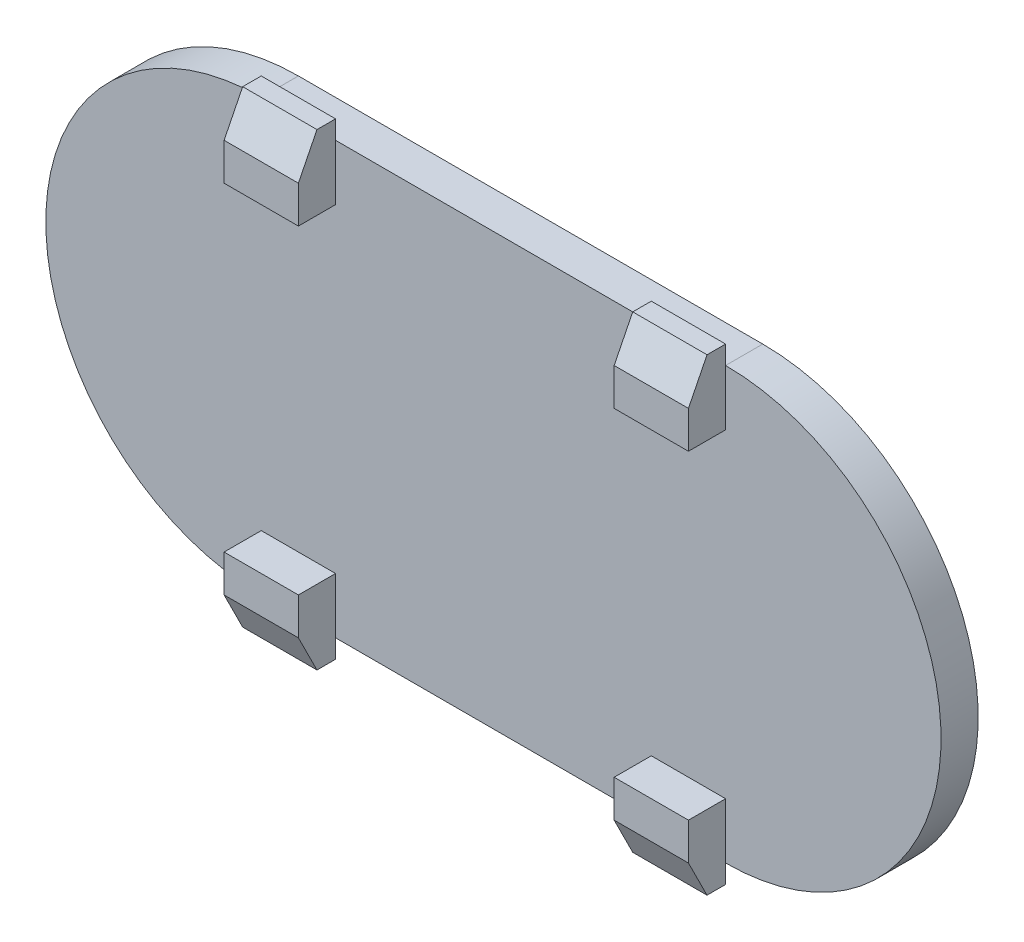
ISO-10303-21;
HEADER;
FILE_DESCRIPTION(('STEP AP214'),'2;1');
FILE_NAME('part.step','',(''),(''),'','','');
FILE_SCHEMA(('AUTOMOTIVE_DESIGN { 1 0 10303 214 1 1 1 1 }'));
ENDSEC;
DATA;
#1=APPLICATION_CONTEXT('core data for automotive mechanical design processes');
#2=APPLICATION_PROTOCOL_DEFINITION('international standard','automotive_design',2000,#1);
#3=PRODUCT_CONTEXT('',#1,'mechanical');
#4=PRODUCT('Part','Part','',(#3));
#5=PRODUCT_RELATED_PRODUCT_CATEGORY('part','',(#4));
#6=PRODUCT_DEFINITION_FORMATION('','',#4);
#7=PRODUCT_DEFINITION_CONTEXT('part definition',#1,'design');
#8=PRODUCT_DEFINITION('design','',#6,#7);
#9=PRODUCT_DEFINITION_SHAPE('','',#8);
#10=(LENGTH_UNIT() NAMED_UNIT(*) SI_UNIT(.MILLI.,.METRE.));
#11=(NAMED_UNIT(*) PLANE_ANGLE_UNIT() SI_UNIT($,.RADIAN.));
#12=(NAMED_UNIT(*) SI_UNIT($,.STERADIAN.) SOLID_ANGLE_UNIT());
#13=UNCERTAINTY_MEASURE_WITH_UNIT(LENGTH_MEASURE(1.E-05),#10,'distance_accuracy_value','');
#14=(GEOMETRIC_REPRESENTATION_CONTEXT(3) GLOBAL_UNCERTAINTY_ASSIGNED_CONTEXT((#13)) GLOBAL_UNIT_ASSIGNED_CONTEXT((#10,
#11,#12)) REPRESENTATION_CONTEXT('',''));
#15=CARTESIAN_POINT('',(0.,0.,0.));
#16=DIRECTION('',(0.,0.,1.));
#17=DIRECTION('',(1.,0.,0.));
#18=AXIS2_PLACEMENT_3D('',#15,#16,#17);
#19=CARTESIAN_POINT('',(5.25,-5.799657207509,1.75));
#20=DIRECTION('',(0.,-0.447213595499998,0.894427190999896));
#21=DIRECTION('',(0.,-0.894427190999896,-0.447213595499998));
#22=AXIS2_PLACEMENT_3D('',#19,#20,#21);
#23=PLANE('',#22);
#24=DIRECTION('',(1.,0.,0.));
#25=VECTOR('',#24,1.);
#26=CARTESIAN_POINT('',(0.,-5.299657207509,2.));
#27=LINE('',#26,#25);
#28=CARTESIAN_POINT('',(4.25,-5.29965720750901,2.00000000000001));
#29=VERTEX_POINT('',#28);
#30=CARTESIAN_POINT('',(6.25,-5.29965720750901,2.00000000000001));
#31=VERTEX_POINT('',#30);
#32=EDGE_CURVE('E280',#29,#31,#27,.T.);
#33=ORIENTED_EDGE('',*,*,#32,.F.);
#34=DIRECTION('',(0.,-0.894427190999896,-0.447213595499998));
#35=VECTOR('',#34,1.);
#36=CARTESIAN_POINT('',(4.25,-5.799657207509,1.75));
#37=LINE('',#36,#35);
#38=CARTESIAN_POINT('',(4.25,-6.299657207509,1.49999999999999));
#39=VERTEX_POINT('',#38);
#40=EDGE_CURVE('E210',#29,#39,#37,.T.);
#41=ORIENTED_EDGE('',*,*,#40,.T.);
#42=DIRECTION('',(1.,0.,0.));
#43=VECTOR('',#42,1.);
#44=CARTESIAN_POINT('',(4.25,-6.299657207509,1.49999999999999));
#45=LINE('',#44,#43);
#46=CARTESIAN_POINT('',(6.25,-6.299657207509,1.49999999999999));
#47=VERTEX_POINT('',#46);
#48=EDGE_CURVE('E213',#47,#39,#45,.F.);
#49=ORIENTED_EDGE('',*,*,#48,.F.);
#50=DIRECTION('',(0.,-0.894427190999896,-0.447213595499998));
#51=VECTOR('',#50,1.);
#52=CARTESIAN_POINT('',(6.25,-5.799657207509,1.75));
#53=LINE('',#52,#51);
#54=EDGE_CURVE('E200',#47,#31,#53,.F.);
#55=ORIENTED_EDGE('',*,*,#54,.T.);
#56=EDGE_LOOP('',(#33,#41,#49,#55));
#57=FACE_BOUND('',#56,.T.);
#58=ADVANCED_FACE('F17',(#57),#23,.T.);
#59=CARTESIAN_POINT('',(-5.25,-5.799657207509,1.75));
#60=DIRECTION('',(0.,-0.447213595499998,0.894427190999896));
#61=DIRECTION('',(0.,-0.894427190999896,-0.447213595499998));
#62=AXIS2_PLACEMENT_3D('',#59,#60,#61);
#63=PLANE('',#62);
#64=DIRECTION('',(1.,0.,0.));
#65=VECTOR('',#64,1.);
#66=CARTESIAN_POINT('',(0.,-5.299657207509,2.));
#67=LINE('',#66,#65);
#68=CARTESIAN_POINT('',(-6.25,-5.29965720750901,2.00000000000001));
#69=VERTEX_POINT('',#68);
#70=CARTESIAN_POINT('',(-4.25,-5.29965720750901,2.00000000000001));
#71=VERTEX_POINT('',#70);
#72=EDGE_CURVE('E252',#69,#71,#67,.T.);
#73=ORIENTED_EDGE('',*,*,#72,.F.);
#74=DIRECTION('',(0.,-0.894427190999896,-0.447213595499998));
#75=VECTOR('',#74,1.);
#76=CARTESIAN_POINT('',(-6.25,-5.799657207509,1.75));
#77=LINE('',#76,#75);
#78=CARTESIAN_POINT('',(-6.25,-6.299657207509,1.49999999999999));
#79=VERTEX_POINT('',#78);
#80=EDGE_CURVE('E349',#69,#79,#77,.T.);
#81=ORIENTED_EDGE('',*,*,#80,.T.);
#82=DIRECTION('',(1.,0.,0.));
#83=VECTOR('',#82,1.);
#84=CARTESIAN_POINT('',(-6.25,-6.299657207509,1.49999999999999));
#85=LINE('',#84,#83);
#86=CARTESIAN_POINT('',(-4.25,-6.299657207509,1.49999999999999));
#87=VERTEX_POINT('',#86);
#88=EDGE_CURVE('E216',#87,#79,#85,.F.);
#89=ORIENTED_EDGE('',*,*,#88,.F.);
#90=DIRECTION('',(0.,-0.894427190999896,-0.447213595499998));
#91=VECTOR('',#90,1.);
#92=CARTESIAN_POINT('',(-4.25,-5.799657207509,1.75));
#93=LINE('',#92,#91);
#94=EDGE_CURVE('E355',#87,#71,#93,.F.);
#95=ORIENTED_EDGE('',*,*,#94,.T.);
#96=EDGE_LOOP('',(#73,#81,#89,#95));
#97=FACE_BOUND('',#96,.T.);
#98=ADVANCED_FACE('F852',(#97),#63,.T.);
#99=CARTESIAN_POINT('',(-5.25,5.799657207509,1.75));
#100=DIRECTION('',(0.,0.447213595499998,0.894427190999896));
#101=DIRECTION('',(0.,-0.894427190999896,0.447213595499998));
#102=AXIS2_PLACEMENT_3D('',#99,#100,#101);
#103=PLANE('',#102);
#104=DIRECTION('',(1.,0.,0.));
#105=VECTOR('',#104,1.);
#106=CARTESIAN_POINT('',(0.,5.299657207509,2.));
#107=LINE('',#106,#105);
#108=CARTESIAN_POINT('',(-4.25,5.29965720750901,2.00000000000001));
#109=VERTEX_POINT('',#108);
#110=CARTESIAN_POINT('',(-6.25,5.29965720750901,2.00000000000001));
#111=VERTEX_POINT('',#110);
#112=EDGE_CURVE('E217',#109,#111,#107,.F.);
#113=ORIENTED_EDGE('',*,*,#112,.F.);
#114=DIRECTION('',(0.,-0.894427190999896,0.447213595499998));
#115=VECTOR('',#114,1.);
#116=CARTESIAN_POINT('',(-4.25,5.799657207509,1.75));
#117=LINE('',#116,#115);
#118=CARTESIAN_POINT('',(-4.25,6.299657207509,1.49999999999999));
#119=VERTEX_POINT('',#118);
#120=EDGE_CURVE('E341',#109,#119,#117,.F.);
#121=ORIENTED_EDGE('',*,*,#120,.T.);
#122=DIRECTION('',(1.,0.,0.));
#123=VECTOR('',#122,1.);
#124=CARTESIAN_POINT('',(-4.25,6.299657207509,1.49999999999999));
#125=LINE('',#124,#123);
#126=CARTESIAN_POINT('',(-6.25,6.299657207509,1.49999999999999));
#127=VERTEX_POINT('',#126);
#128=EDGE_CURVE('E243',#127,#119,#125,.T.);
#129=ORIENTED_EDGE('',*,*,#128,.F.);
#130=DIRECTION('',(0.,-0.894427190999896,0.447213595499998));
#131=VECTOR('',#130,1.);
#132=CARTESIAN_POINT('',(-6.25,5.799657207509,1.75));
#133=LINE('',#132,#131);
#134=EDGE_CURVE('E347',#127,#111,#133,.T.);
#135=ORIENTED_EDGE('',*,*,#134,.T.);
#136=EDGE_LOOP('',(#113,#121,#129,#135));
#137=FACE_BOUND('',#136,.T.);
#138=ADVANCED_FACE('F845',(#137),#103,.T.);
#139=CARTESIAN_POINT('',(5.25,5.799657207509,1.75));
#140=DIRECTION('',(0.,0.447213595499998,0.894427190999896));
#141=DIRECTION('',(0.,-0.894427190999896,0.447213595499998));
#142=AXIS2_PLACEMENT_3D('',#139,#140,#141);
#143=PLANE('',#142);
#144=DIRECTION('',(1.,0.,0.));
#145=VECTOR('',#144,1.);
#146=CARTESIAN_POINT('',(0.,5.299657207509,2.));
#147=LINE('',#146,#145);
#148=CARTESIAN_POINT('',(6.25,5.29965720750901,2.00000000000001));
#149=VERTEX_POINT('',#148);
#150=CARTESIAN_POINT('',(4.25,5.29965720750901,2.00000000000001));
#151=VERTEX_POINT('',#150);
#152=EDGE_CURVE('E304',#149,#151,#147,.F.);
#153=ORIENTED_EDGE('',*,*,#152,.F.);
#154=DIRECTION('',(0.,-0.894427190999896,0.447213595499998));
#155=VECTOR('',#154,1.);
#156=CARTESIAN_POINT('',(6.25,5.799657207509,1.75));
#157=LINE('',#156,#155);
#158=CARTESIAN_POINT('',(6.25,6.299657207509,1.49999999999999));
#159=VERTEX_POINT('',#158);
#160=EDGE_CURVE('E327',#149,#159,#157,.F.);
#161=ORIENTED_EDGE('',*,*,#160,.T.);
#162=DIRECTION('',(1.,0.,0.));
#163=VECTOR('',#162,1.);
#164=CARTESIAN_POINT('',(6.25,6.299657207509,1.49999999999999));
#165=LINE('',#164,#163);
#166=CARTESIAN_POINT('',(4.25,6.299657207509,1.49999999999999));
#167=VERTEX_POINT('',#166);
#168=EDGE_CURVE('E246',#167,#159,#165,.T.);
#169=ORIENTED_EDGE('',*,*,#168,.F.);
#170=DIRECTION('',(0.,-0.894427190999896,0.447213595499998));
#171=VECTOR('',#170,1.);
#172=CARTESIAN_POINT('',(4.25,5.799657207509,1.75));
#173=LINE('',#172,#171);
#174=EDGE_CURVE('E339',#167,#151,#173,.T.);
#175=ORIENTED_EDGE('',*,*,#174,.T.);
#176=EDGE_LOOP('',(#153,#161,#169,#175));
#177=FACE_BOUND('',#176,.T.);
#178=ADVANCED_FACE('F630',(#177),#143,.T.);
#179=CARTESIAN_POINT('',(0.,0.,2.));
#180=DIRECTION('',(0.,0.,1.));
#181=DIRECTION('',(1.,0.,0.));
#182=AXIS2_PLACEMENT_3D('',#179,#180,#181);
#183=PLANE('',#182);
#184=DIRECTION('',(0.,1.,0.));
#185=VECTOR('',#184,1.);
#186=CARTESIAN_POINT('',(4.25,6.299657207509,2.));
#187=LINE('',#186,#185);
#188=CARTESIAN_POINT('',(4.25,4.299657207509,2.));
#189=VERTEX_POINT('',#188);
#190=EDGE_CURVE('E321',#189,#151,#187,.T.);
#191=ORIENTED_EDGE('',*,*,#190,.F.);
#192=DIRECTION('',(1.,0.,0.));
#193=VECTOR('',#192,1.);
#194=CARTESIAN_POINT('',(4.25,4.299657207509,2.));
#195=LINE('',#194,#193);
#196=CARTESIAN_POINT('',(6.25,4.299657207509,2.));
#197=VERTEX_POINT('',#196);
#198=EDGE_CURVE('E312',#197,#189,#195,.F.);
#199=ORIENTED_EDGE('',*,*,#198,.F.);
#200=DIRECTION('',(0.,1.,0.));
#201=VECTOR('',#200,1.);
#202=CARTESIAN_POINT('',(6.25,0.,2.));
#203=LINE('',#202,#201);
#204=EDGE_CURVE('E324',#197,#149,#203,.T.);
#205=ORIENTED_EDGE('',*,*,#204,.T.);
#206=ORIENTED_EDGE('',*,*,#152,.T.);
#207=EDGE_LOOP('',(#191,#199,#205,#206));
#208=FACE_BOUND('',#207,.T.);
#209=ADVANCED_FACE('F627',(#208),#183,.T.);
#210=CARTESIAN_POINT('',(0.,0.,2.));
#211=DIRECTION('',(0.,0.,1.));
#212=DIRECTION('',(1.,0.,0.));
#213=AXIS2_PLACEMENT_3D('',#210,#211,#212);
#214=PLANE('',#213);
#215=DIRECTION('',(0.,1.,0.));
#216=VECTOR('',#215,1.);
#217=CARTESIAN_POINT('',(6.25,-6.299657207509,2.));
#218=LINE('',#217,#216);
#219=CARTESIAN_POINT('',(6.25,-4.299657207509,2.));
#220=VERTEX_POINT('',#219);
#221=EDGE_CURVE('E209',#220,#31,#218,.F.);
#222=ORIENTED_EDGE('',*,*,#221,.F.);
#223=DIRECTION('',(1.,0.,0.));
#224=VECTOR('',#223,1.);
#225=CARTESIAN_POINT('',(6.25,-4.299657207509,2.));
#226=LINE('',#225,#224);
#227=CARTESIAN_POINT('',(4.25,-4.299657207509,2.));
#228=VERTEX_POINT('',#227);
#229=EDGE_CURVE('E226',#228,#220,#226,.T.);
#230=ORIENTED_EDGE('',*,*,#229,.F.);
#231=DIRECTION('',(0.,1.,0.));
#232=VECTOR('',#231,1.);
#233=CARTESIAN_POINT('',(4.25,0.,2.));
#234=LINE('',#233,#232);
#235=EDGE_CURVE('E301',#228,#29,#234,.F.);
#236=ORIENTED_EDGE('',*,*,#235,.T.);
#237=ORIENTED_EDGE('',*,*,#32,.T.);
#238=EDGE_LOOP('',(#222,#230,#236,#237));
#239=FACE_BOUND('',#238,.T.);
#240=ADVANCED_FACE('F824',(#239),#214,.T.);
#241=CARTESIAN_POINT('',(0.,0.,2.));
#242=DIRECTION('',(0.,0.,1.));
#243=DIRECTION('',(1.,0.,0.));
#244=AXIS2_PLACEMENT_3D('',#241,#242,#243);
#245=PLANE('',#244);
#246=DIRECTION('',(0.,1.,0.));
#247=VECTOR('',#246,1.);
#248=CARTESIAN_POINT('',(-4.25,-6.299657207509,2.));
#249=LINE('',#248,#247);
#250=CARTESIAN_POINT('',(-4.25,-4.299657207509,2.));
#251=VERTEX_POINT('',#250);
#252=EDGE_CURVE('E283',#251,#71,#249,.F.);
#253=ORIENTED_EDGE('',*,*,#252,.F.);
#254=DIRECTION('',(1.,0.,0.));
#255=VECTOR('',#254,1.);
#256=CARTESIAN_POINT('',(-4.25,-4.299657207509,2.));
#257=LINE('',#256,#255);
#258=CARTESIAN_POINT('',(-6.25,-4.299657207509,2.));
#259=VERTEX_POINT('',#258);
#260=EDGE_CURVE('E266',#259,#251,#257,.T.);
#261=ORIENTED_EDGE('',*,*,#260,.F.);
#262=DIRECTION('',(0.,1.,0.));
#263=VECTOR('',#262,1.);
#264=CARTESIAN_POINT('',(-6.25,0.,2.));
#265=LINE('',#264,#263);
#266=EDGE_CURVE('E277',#259,#69,#265,.F.);
#267=ORIENTED_EDGE('',*,*,#266,.T.);
#268=ORIENTED_EDGE('',*,*,#72,.T.);
#269=EDGE_LOOP('',(#253,#261,#267,#268));
#270=FACE_BOUND('',#269,.T.);
#271=ADVANCED_FACE('F816',(#270),#245,.T.);
#272=CARTESIAN_POINT('',(0.,0.,2.));
#273=DIRECTION('',(0.,0.,1.));
#274=DIRECTION('',(1.,0.,0.));
#275=AXIS2_PLACEMENT_3D('',#272,#273,#274);
#276=PLANE('',#275);
#277=DIRECTION('',(0.,1.,0.));
#278=VECTOR('',#277,1.);
#279=CARTESIAN_POINT('',(-6.25,6.299657207509,2.));
#280=LINE('',#279,#278);
#281=CARTESIAN_POINT('',(-6.25,4.299657207509,2.));
#282=VERTEX_POINT('',#281);
#283=EDGE_CURVE('E255',#282,#111,#280,.T.);
#284=ORIENTED_EDGE('',*,*,#283,.F.);
#285=DIRECTION('',(1.,0.,0.));
#286=VECTOR('',#285,1.);
#287=CARTESIAN_POINT('',(-6.25,4.299657207509,2.));
#288=LINE('',#287,#286);
#289=CARTESIAN_POINT('',(-4.25,4.299657207509,2.));
#290=VERTEX_POINT('',#289);
#291=EDGE_CURVE('E236',#290,#282,#288,.F.);
#292=ORIENTED_EDGE('',*,*,#291,.F.);
#293=DIRECTION('',(0.,1.,0.));
#294=VECTOR('',#293,1.);
#295=CARTESIAN_POINT('',(-4.25,0.,2.));
#296=LINE('',#295,#294);
#297=EDGE_CURVE('E249',#290,#109,#296,.T.);
#298=ORIENTED_EDGE('',*,*,#297,.T.);
#299=ORIENTED_EDGE('',*,*,#112,.T.);
#300=EDGE_LOOP('',(#284,#292,#298,#299));
#301=FACE_BOUND('',#300,.T.);
#302=ADVANCED_FACE('F809',(#301),#276,.T.);
#303=CARTESIAN_POINT('',(4.25,-6.299657207509,1.));
#304=DIRECTION('',(0.,-1.,0.));
#305=DIRECTION('',(0.,0.,-1.));
#306=AXIS2_PLACEMENT_3D('',#303,#304,#305);
#307=PLANE('',#306);
#308=DIRECTION('',(0.,0.,1.));
#309=VECTOR('',#308,1.);
#310=CARTESIAN_POINT('',(4.25,-6.299657207509,1.));
#311=LINE('',#310,#309);
#312=CARTESIAN_POINT('',(4.25,-6.299657207509,1.));
#313=VERTEX_POINT('',#312);
#314=EDGE_CURVE('E296',#313,#39,#311,.T.);
#315=ORIENTED_EDGE('',*,*,#314,.F.);
#316=DIRECTION('',(1.,0.,0.));
#317=VECTOR('',#316,1.);
#318=CARTESIAN_POINT('',(0.,-6.299657207509,1.));
#319=LINE('',#318,#317);
#320=CARTESIAN_POINT('',(6.25,-6.299657207509,1.));
#321=VERTEX_POINT('',#320);
#322=EDGE_CURVE('E221',#313,#321,#319,.T.);
#323=ORIENTED_EDGE('',*,*,#322,.T.);
#324=DIRECTION('',(0.,0.,-1.));
#325=VECTOR('',#324,1.);
#326=CARTESIAN_POINT('',(6.25,-6.299657207509,1.));
#327=LINE('',#326,#325);
#328=EDGE_CURVE('E206',#47,#321,#327,.T.);
#329=ORIENTED_EDGE('',*,*,#328,.F.);
#330=ORIENTED_EDGE('',*,*,#48,.T.);
#331=EDGE_LOOP('',(#315,#323,#329,#330));
#332=FACE_BOUND('',#331,.T.);
#333=ADVANCED_FACE('F219',(#332),#307,.T.);
#334=CARTESIAN_POINT('',(-6.25,-6.299657207509,1.));
#335=DIRECTION('',(0.,-1.,0.));
#336=DIRECTION('',(0.,0.,-1.));
#337=AXIS2_PLACEMENT_3D('',#334,#335,#336);
#338=PLANE('',#337);
#339=DIRECTION('',(0.,0.,1.));
#340=VECTOR('',#339,1.);
#341=CARTESIAN_POINT('',(-6.25,-6.299657207509,1.));
#342=LINE('',#341,#340);
#343=CARTESIAN_POINT('',(-6.25,-6.299657207509,1.));
#344=VERTEX_POINT('',#343);
#345=EDGE_CURVE('E269',#344,#79,#342,.T.);
#346=ORIENTED_EDGE('',*,*,#345,.F.);
#347=DIRECTION('',(1.,0.,0.));
#348=VECTOR('',#347,1.);
#349=CARTESIAN_POINT('',(0.,-6.299657207509,1.));
#350=LINE('',#349,#348);
#351=CARTESIAN_POINT('',(-4.25,-6.299657207509,1.));
#352=VERTEX_POINT('',#351);
#353=EDGE_CURVE('E452',#344,#352,#350,.T.);
#354=ORIENTED_EDGE('',*,*,#353,.T.);
#355=DIRECTION('',(0.,0.,-1.));
#356=VECTOR('',#355,1.);
#357=CARTESIAN_POINT('',(-4.25,-6.299657207509,1.));
#358=LINE('',#357,#356);
#359=EDGE_CURVE('E286',#87,#352,#358,.T.);
#360=ORIENTED_EDGE('',*,*,#359,.F.);
#361=ORIENTED_EDGE('',*,*,#88,.T.);
#362=EDGE_LOOP('',(#346,#354,#360,#361));
#363=FACE_BOUND('',#362,.T.);
#364=ADVANCED_FACE('F642',(#363),#338,.T.);
#365=CARTESIAN_POINT('',(-4.25,6.299657207509,1.));
#366=DIRECTION('',(0.,1.,0.));
#367=DIRECTION('',(0.,0.,1.));
#368=AXIS2_PLACEMENT_3D('',#365,#366,#367);
#369=PLANE('',#368);
#370=DIRECTION('',(0.,0.,-1.));
#371=VECTOR('',#370,1.);
#372=CARTESIAN_POINT('',(-4.25,6.299657207509,1.));
#373=LINE('',#372,#371);
#374=CARTESIAN_POINT('',(-4.25,6.299657207509,1.));
#375=VERTEX_POINT('',#374);
#376=EDGE_CURVE('E239',#375,#119,#373,.F.);
#377=ORIENTED_EDGE('',*,*,#376,.F.);
#378=DIRECTION('',(1.,0.,0.));
#379=VECTOR('',#378,1.);
#380=CARTESIAN_POINT('',(0.,6.299657207509,1.));
#381=LINE('',#380,#379);
#382=CARTESIAN_POINT('',(-6.25,6.299657207509,1.));
#383=VERTEX_POINT('',#382);
#384=EDGE_CURVE('E428',#375,#383,#381,.F.);
#385=ORIENTED_EDGE('',*,*,#384,.T.);
#386=DIRECTION('',(0.,0.,1.));
#387=VECTOR('',#386,1.);
#388=CARTESIAN_POINT('',(-6.25,6.299657207509,1.));
#389=LINE('',#388,#387);
#390=EDGE_CURVE('E258',#127,#383,#389,.F.);
#391=ORIENTED_EDGE('',*,*,#390,.F.);
#392=ORIENTED_EDGE('',*,*,#128,.T.);
#393=EDGE_LOOP('',(#377,#385,#391,#392));
#394=FACE_BOUND('',#393,.T.);
#395=ADVANCED_FACE('F634',(#394),#369,.T.);
#396=CARTESIAN_POINT('',(6.25,6.299657207509,1.));
#397=DIRECTION('',(0.,1.,0.));
#398=DIRECTION('',(0.,0.,1.));
#399=AXIS2_PLACEMENT_3D('',#396,#397,#398);
#400=PLANE('',#399);
#401=DIRECTION('',(0.,0.,-1.));
#402=VECTOR('',#401,1.);
#403=CARTESIAN_POINT('',(6.25,6.299657207509,1.));
#404=LINE('',#403,#402);
#405=CARTESIAN_POINT('',(6.25,6.299657207509,1.));
#406=VERTEX_POINT('',#405);
#407=EDGE_CURVE('E315',#406,#159,#404,.F.);
#408=ORIENTED_EDGE('',*,*,#407,.F.);
#409=DIRECTION('',(1.,0.,0.));
#410=VECTOR('',#409,1.);
#411=CARTESIAN_POINT('',(0.,6.299657207509,1.));
#412=LINE('',#411,#410);
#413=CARTESIAN_POINT('',(4.25,6.299657207509,1.));
#414=VERTEX_POINT('',#413);
#415=EDGE_CURVE('E422',#406,#414,#412,.F.);
#416=ORIENTED_EDGE('',*,*,#415,.T.);
#417=DIRECTION('',(0.,0.,1.));
#418=VECTOR('',#417,1.);
#419=CARTESIAN_POINT('',(4.25,6.299657207509,1.));
#420=LINE('',#419,#418);
#421=EDGE_CURVE('E332',#167,#414,#420,.F.);
#422=ORIENTED_EDGE('',*,*,#421,.F.);
#423=ORIENTED_EDGE('',*,*,#168,.T.);
#424=EDGE_LOOP('',(#408,#416,#422,#423));
#425=FACE_BOUND('',#424,.T.);
#426=ADVANCED_FACE('F632',(#425),#400,.T.);
#427=CARTESIAN_POINT('',(4.25,6.299657207509,1.));
#428=DIRECTION('',(-1.,0.,0.));
#429=DIRECTION('',(0.,0.,1.));
#430=AXIS2_PLACEMENT_3D('',#427,#428,#429);
#431=PLANE('',#430);
#432=DIRECTION('',(0.,1.,0.));
#433=VECTOR('',#432,1.);
#434=CARTESIAN_POINT('',(4.25,0.,1.));
#435=LINE('',#434,#433);
#436=CARTESIAN_POINT('',(4.25,5.799657207509,1.));
#437=VERTEX_POINT('',#436);
#438=CARTESIAN_POINT('',(4.25,4.299657207509,1.));
#439=VERTEX_POINT('',#438);
#440=EDGE_CURVE('E435',#437,#439,#435,.F.);
#441=ORIENTED_EDGE('',*,*,#440,.T.);
#442=DIRECTION('',(0.,0.,-1.));
#443=VECTOR('',#442,1.);
#444=CARTESIAN_POINT('',(4.25,4.299657207509,1.));
#445=LINE('',#444,#443);
#446=EDGE_CURVE('E316',#189,#439,#445,.T.);
#447=ORIENTED_EDGE('',*,*,#446,.F.);
#448=ORIENTED_EDGE('',*,*,#190,.T.);
#449=ORIENTED_EDGE('',*,*,#174,.F.);
#450=ORIENTED_EDGE('',*,*,#421,.T.);
#451=DIRECTION('',(0.,1.,0.));
#452=VECTOR('',#451,1.);
#453=CARTESIAN_POINT('',(4.25,0.,1.));
#454=LINE('',#453,#452);
#455=EDGE_CURVE('E423',#414,#437,#454,.F.);
#456=ORIENTED_EDGE('',*,*,#455,.T.);
#457=EDGE_LOOP('',(#441,#447,#448,#449,#450,#456));
#458=FACE_BOUND('',#457,.T.);
#459=ADVANCED_FACE('F611',(#458),#431,.T.);
#460=CARTESIAN_POINT('',(4.25,4.299657207509,1.));
#461=DIRECTION('',(0.,-1.,0.));
#462=DIRECTION('',(0.,0.,-1.));
#463=AXIS2_PLACEMENT_3D('',#460,#461,#462);
#464=PLANE('',#463);
#465=DIRECTION('',(0.,0.,-1.));
#466=VECTOR('',#465,1.);
#467=CARTESIAN_POINT('',(6.25,4.299657207509,1.));
#468=LINE('',#467,#466);
#469=CARTESIAN_POINT('',(6.25,4.299657207509,1.));
#470=VERTEX_POINT('',#469);
#471=EDGE_CURVE('E228',#197,#470,#468,.T.);
#472=ORIENTED_EDGE('',*,*,#471,.F.);
#473=ORIENTED_EDGE('',*,*,#198,.T.);
#474=ORIENTED_EDGE('',*,*,#446,.T.);
#475=DIRECTION('',(-1.,0.,0.));
#476=VECTOR('',#475,1.);
#477=CARTESIAN_POINT('',(0.,4.299657207509,1.));
#478=LINE('',#477,#476);
#479=EDGE_CURVE('E414',#439,#470,#478,.F.);
#480=ORIENTED_EDGE('',*,*,#479,.T.);
#481=EDGE_LOOP('',(#472,#473,#474,#480));
#482=FACE_BOUND('',#481,.T.);
#483=ADVANCED_FACE('F623',(#482),#464,.T.);
#484=CARTESIAN_POINT('',(6.25,4.299657207509,1.));
#485=DIRECTION('',(1.,0.,0.));
#486=DIRECTION('',(0.,0.,-1.));
#487=AXIS2_PLACEMENT_3D('',#484,#485,#486);
#488=PLANE('',#487);
#489=DIRECTION('',(0.,1.,0.));
#490=VECTOR('',#489,1.);
#491=CARTESIAN_POINT('',(6.25,0.,1.));
#492=LINE('',#491,#490);
#493=CARTESIAN_POINT('',(6.25,5.799657207509,1.));
#494=VERTEX_POINT('',#493);
#495=EDGE_CURVE('E410',#470,#494,#492,.T.);
#496=ORIENTED_EDGE('',*,*,#495,.T.);
#497=DIRECTION('',(0.,1.,0.));
#498=VECTOR('',#497,1.);
#499=CARTESIAN_POINT('',(6.25,0.,1.));
#500=LINE('',#499,#498);
#501=EDGE_CURVE('E419',#494,#406,#500,.T.);
#502=ORIENTED_EDGE('',*,*,#501,.T.);
#503=ORIENTED_EDGE('',*,*,#407,.T.);
#504=ORIENTED_EDGE('',*,*,#160,.F.);
#505=ORIENTED_EDGE('',*,*,#204,.F.);
#506=ORIENTED_EDGE('',*,*,#471,.T.);
#507=EDGE_LOOP('',(#496,#502,#503,#504,#505,#506));
#508=FACE_BOUND('',#507,.T.);
#509=ADVANCED_FACE('F619',(#508),#488,.T.);
#510=CARTESIAN_POINT('',(6.25,-6.299657207509,1.));
#511=DIRECTION('',(1.,0.,0.));
#512=DIRECTION('',(0.,0.,-1.));
#513=AXIS2_PLACEMENT_3D('',#510,#511,#512);
#514=PLANE('',#513);
#515=DIRECTION('',(0.,1.,0.));
#516=VECTOR('',#515,1.);
#517=CARTESIAN_POINT('',(6.25,0.,1.));
#518=LINE('',#517,#516);
#519=CARTESIAN_POINT('',(6.25,-5.799657207509,1.));
#520=VERTEX_POINT('',#519);
#521=CARTESIAN_POINT('',(6.25,-4.299657207509,1.));
#522=VERTEX_POINT('',#521);
#523=EDGE_CURVE('E407',#520,#522,#518,.T.);
#524=ORIENTED_EDGE('',*,*,#523,.T.);
#525=DIRECTION('',(0.,0.,1.));
#526=VECTOR('',#525,1.);
#527=CARTESIAN_POINT('',(6.25,-4.299657207509,1.));
#528=LINE('',#527,#526);
#529=EDGE_CURVE('E223',#220,#522,#528,.F.);
#530=ORIENTED_EDGE('',*,*,#529,.F.);
#531=ORIENTED_EDGE('',*,*,#221,.T.);
#532=ORIENTED_EDGE('',*,*,#54,.F.);
#533=ORIENTED_EDGE('',*,*,#328,.T.);
#534=DIRECTION('',(0.,1.,0.));
#535=VECTOR('',#534,1.);
#536=CARTESIAN_POINT('',(6.25,0.,1.));
#537=LINE('',#536,#535);
#538=EDGE_CURVE('E479',#321,#520,#537,.T.);
#539=ORIENTED_EDGE('',*,*,#538,.T.);
#540=EDGE_LOOP('',(#524,#530,#531,#532,#533,#539));
#541=FACE_BOUND('',#540,.T.);
#542=ADVANCED_FACE('F204',(#541),#514,.T.);
#543=CARTESIAN_POINT('',(6.25,-4.299657207509,1.));
#544=DIRECTION('',(0.,1.,0.));
#545=DIRECTION('',(0.,0.,1.));
#546=AXIS2_PLACEMENT_3D('',#543,#544,#545);
#547=PLANE('',#546);
#548=DIRECTION('',(0.,0.,1.));
#549=VECTOR('',#548,1.);
#550=CARTESIAN_POINT('',(4.25,-4.299657207509,1.));
#551=LINE('',#550,#549);
#552=CARTESIAN_POINT('',(4.25,-4.299657207509,1.));
#553=VERTEX_POINT('',#552);
#554=EDGE_CURVE('E287',#228,#553,#551,.F.);
#555=ORIENTED_EDGE('',*,*,#554,.F.);
#556=ORIENTED_EDGE('',*,*,#229,.T.);
#557=ORIENTED_EDGE('',*,*,#529,.T.);
#558=DIRECTION('',(-1.,0.,0.));
#559=VECTOR('',#558,1.);
#560=CARTESIAN_POINT('',(0.,-4.299657207509,1.));
#561=LINE('',#560,#559);
#562=EDGE_CURVE('E409',#522,#553,#561,.T.);
#563=ORIENTED_EDGE('',*,*,#562,.T.);
#564=EDGE_LOOP('',(#555,#556,#557,#563));
#565=FACE_BOUND('',#564,.T.);
#566=ADVANCED_FACE('F579',(#565),#547,.T.);
#567=CARTESIAN_POINT('',(4.25,-4.299657207509,1.));
#568=DIRECTION('',(-1.,0.,0.));
#569=DIRECTION('',(0.,0.,1.));
#570=AXIS2_PLACEMENT_3D('',#567,#568,#569);
#571=PLANE('',#570);
#572=DIRECTION('',(0.,1.,0.));
#573=VECTOR('',#572,1.);
#574=CARTESIAN_POINT('',(4.25,0.,1.));
#575=LINE('',#574,#573);
#576=CARTESIAN_POINT('',(4.25,-5.799657207509,1.));
#577=VERTEX_POINT('',#576);
#578=EDGE_CURVE('E473',#553,#577,#575,.F.);
#579=ORIENTED_EDGE('',*,*,#578,.T.);
#580=DIRECTION('',(0.,1.,0.));
#581=VECTOR('',#580,1.);
#582=CARTESIAN_POINT('',(4.25,0.,1.));
#583=LINE('',#582,#581);
#584=EDGE_CURVE('E481',#577,#313,#583,.F.);
#585=ORIENTED_EDGE('',*,*,#584,.T.);
#586=ORIENTED_EDGE('',*,*,#314,.T.);
#587=ORIENTED_EDGE('',*,*,#40,.F.);
#588=ORIENTED_EDGE('',*,*,#235,.F.);
#589=ORIENTED_EDGE('',*,*,#554,.T.);
#590=EDGE_LOOP('',(#579,#585,#586,#587,#588,#589));
#591=FACE_BOUND('',#590,.T.);
#592=ADVANCED_FACE('F567',(#591),#571,.T.);
#593=CARTESIAN_POINT('',(-4.25,-6.299657207509,1.));
#594=DIRECTION('',(1.,0.,0.));
#595=DIRECTION('',(0.,0.,-1.));
#596=AXIS2_PLACEMENT_3D('',#593,#594,#595);
#597=PLANE('',#596);
#598=DIRECTION('',(0.,1.,0.));
#599=VECTOR('',#598,1.);
#600=CARTESIAN_POINT('',(-4.25,0.,1.));
#601=LINE('',#600,#599);
#602=CARTESIAN_POINT('',(-4.25,-5.799657207509,1.));
#603=VERTEX_POINT('',#602);
#604=CARTESIAN_POINT('',(-4.25,-4.299657207509,1.));
#605=VERTEX_POINT('',#604);
#606=EDGE_CURVE('E471',#603,#605,#601,.T.);
#607=ORIENTED_EDGE('',*,*,#606,.T.);
#608=DIRECTION('',(0.,0.,1.));
#609=VECTOR('',#608,1.);
#610=CARTESIAN_POINT('',(-4.25,-4.299657207509,1.));
#611=LINE('',#610,#609);
#612=EDGE_CURVE('E270',#251,#605,#611,.F.);
#613=ORIENTED_EDGE('',*,*,#612,.F.);
#614=ORIENTED_EDGE('',*,*,#252,.T.);
#615=ORIENTED_EDGE('',*,*,#94,.F.);
#616=ORIENTED_EDGE('',*,*,#359,.T.);
#617=DIRECTION('',(0.,1.,0.));
#618=VECTOR('',#617,1.);
#619=CARTESIAN_POINT('',(-4.25,0.,1.));
#620=LINE('',#619,#618);
#621=EDGE_CURVE('E79',#352,#603,#620,.T.);
#622=ORIENTED_EDGE('',*,*,#621,.T.);
#623=EDGE_LOOP('',(#607,#613,#614,#615,#616,#622));
#624=FACE_BOUND('',#623,.T.);
#625=ADVANCED_FACE('F687',(#624),#597,.T.);
#626=CARTESIAN_POINT('',(-4.25,-4.299657207509,1.));
#627=DIRECTION('',(0.,1.,0.));
#628=DIRECTION('',(0.,0.,1.));
#629=AXIS2_PLACEMENT_3D('',#626,#627,#628);
#630=PLANE('',#629);
#631=DIRECTION('',(0.,0.,1.));
#632=VECTOR('',#631,1.);
#633=CARTESIAN_POINT('',(-6.25,-4.299657207509,1.));
#634=LINE('',#633,#632);
#635=CARTESIAN_POINT('',(-6.25,-4.299657207509,1.));
#636=VERTEX_POINT('',#635);
#637=EDGE_CURVE('E259',#259,#636,#634,.F.);
#638=ORIENTED_EDGE('',*,*,#637,.F.);
#639=ORIENTED_EDGE('',*,*,#260,.T.);
#640=ORIENTED_EDGE('',*,*,#612,.T.);
#641=DIRECTION('',(-1.,0.,0.));
#642=VECTOR('',#641,1.);
#643=CARTESIAN_POINT('',(0.,-4.299657207509,1.));
#644=LINE('',#643,#642);
#645=EDGE_CURVE('E404',#605,#636,#644,.T.);
#646=ORIENTED_EDGE('',*,*,#645,.T.);
#647=EDGE_LOOP('',(#638,#639,#640,#646));
#648=FACE_BOUND('',#647,.T.);
#649=ADVANCED_FACE('F683',(#648),#630,.T.);
#650=CARTESIAN_POINT('',(-6.25,-4.299657207509,1.));
#651=DIRECTION('',(-1.,0.,0.));
#652=DIRECTION('',(0.,0.,1.));
#653=AXIS2_PLACEMENT_3D('',#650,#651,#652);
#654=PLANE('',#653);
#655=DIRECTION('',(0.,1.,0.));
#656=VECTOR('',#655,1.);
#657=CARTESIAN_POINT('',(-6.25,0.,1.));
#658=LINE('',#657,#656);
#659=CARTESIAN_POINT('',(-6.25,-5.799657207509,1.));
#660=VERTEX_POINT('',#659);
#661=EDGE_CURVE('E400',#636,#660,#658,.F.);
#662=ORIENTED_EDGE('',*,*,#661,.T.);
#663=DIRECTION('',(0.,1.,0.));
#664=VECTOR('',#663,1.);
#665=CARTESIAN_POINT('',(-6.25,0.,1.));
#666=LINE('',#665,#664);
#667=EDGE_CURVE('E459',#660,#344,#666,.F.);
#668=ORIENTED_EDGE('',*,*,#667,.T.);
#669=ORIENTED_EDGE('',*,*,#345,.T.);
#670=ORIENTED_EDGE('',*,*,#80,.F.);
#671=ORIENTED_EDGE('',*,*,#266,.F.);
#672=ORIENTED_EDGE('',*,*,#637,.T.);
#673=EDGE_LOOP('',(#662,#668,#669,#670,#671,#672));
#674=FACE_BOUND('',#673,.T.);
#675=ADVANCED_FACE('F680',(#674),#654,.T.);
#676=CARTESIAN_POINT('',(-6.25,6.299657207509,1.));
#677=DIRECTION('',(-1.,0.,0.));
#678=DIRECTION('',(0.,0.,1.));
#679=AXIS2_PLACEMENT_3D('',#676,#677,#678);
#680=PLANE('',#679);
#681=DIRECTION('',(0.,1.,0.));
#682=VECTOR('',#681,1.);
#683=CARTESIAN_POINT('',(-6.25,0.,1.));
#684=LINE('',#683,#682);
#685=CARTESIAN_POINT('',(-6.25,5.799657207509,1.));
#686=VERTEX_POINT('',#685);
#687=CARTESIAN_POINT('',(-6.25,4.299657207509,1.));
#688=VERTEX_POINT('',#687);
#689=EDGE_CURVE('E397',#686,#688,#684,.F.);
#690=ORIENTED_EDGE('',*,*,#689,.T.);
#691=DIRECTION('',(0.,0.,-1.));
#692=VECTOR('',#691,1.);
#693=CARTESIAN_POINT('',(-6.25,4.299657207509,1.));
#694=LINE('',#693,#692);
#695=EDGE_CURVE('E240',#282,#688,#694,.T.);
#696=ORIENTED_EDGE('',*,*,#695,.F.);
#697=ORIENTED_EDGE('',*,*,#283,.T.);
#698=ORIENTED_EDGE('',*,*,#134,.F.);
#699=ORIENTED_EDGE('',*,*,#390,.T.);
#700=DIRECTION('',(0.,1.,0.));
#701=VECTOR('',#700,1.);
#702=CARTESIAN_POINT('',(-6.25,0.,1.));
#703=LINE('',#702,#701);
#704=EDGE_CURVE('E62',#383,#686,#703,.F.);
#705=ORIENTED_EDGE('',*,*,#704,.T.);
#706=EDGE_LOOP('',(#690,#696,#697,#698,#699,#705));
#707=FACE_BOUND('',#706,.T.);
#708=ADVANCED_FACE('F676',(#707),#680,.T.);
#709=CARTESIAN_POINT('',(-6.25,4.299657207509,1.));
#710=DIRECTION('',(0.,-1.,0.));
#711=DIRECTION('',(0.,0.,-1.));
#712=AXIS2_PLACEMENT_3D('',#709,#710,#711);
#713=PLANE('',#712);
#714=DIRECTION('',(0.,0.,-1.));
#715=VECTOR('',#714,1.);
#716=CARTESIAN_POINT('',(-4.25,4.299657207509,1.));
#717=LINE('',#716,#715);
#718=CARTESIAN_POINT('',(-4.25,4.299657207509,1.));
#719=VERTEX_POINT('',#718);
#720=EDGE_CURVE('E482',#290,#719,#717,.T.);
#721=ORIENTED_EDGE('',*,*,#720,.F.);
#722=ORIENTED_EDGE('',*,*,#291,.T.);
#723=ORIENTED_EDGE('',*,*,#695,.T.);
#724=DIRECTION('',(-1.,0.,0.));
#725=VECTOR('',#724,1.);
#726=CARTESIAN_POINT('',(0.,4.299657207509,1.));
#727=LINE('',#726,#725);
#728=EDGE_CURVE('E399',#688,#719,#727,.F.);
#729=ORIENTED_EDGE('',*,*,#728,.T.);
#730=EDGE_LOOP('',(#721,#722,#723,#729));
#731=FACE_BOUND('',#730,.T.);
#732=ADVANCED_FACE('F673',(#731),#713,.T.);
#733=CARTESIAN_POINT('',(-4.25,4.299657207509,1.));
#734=DIRECTION('',(1.,0.,0.));
#735=DIRECTION('',(0.,0.,-1.));
#736=AXIS2_PLACEMENT_3D('',#733,#734,#735);
#737=PLANE('',#736);
#738=DIRECTION('',(0.,1.,0.));
#739=VECTOR('',#738,1.);
#740=CARTESIAN_POINT('',(-4.25,0.,1.));
#741=LINE('',#740,#739);
#742=CARTESIAN_POINT('',(-4.25,5.799657207509,1.));
#743=VERTEX_POINT('',#742);
#744=EDGE_CURVE('E394',#719,#743,#741,.T.);
#745=ORIENTED_EDGE('',*,*,#744,.T.);
#746=DIRECTION('',(0.,1.,0.));
#747=VECTOR('',#746,1.);
#748=CARTESIAN_POINT('',(-4.25,0.,1.));
#749=LINE('',#748,#747);
#750=EDGE_CURVE('E446',#743,#375,#749,.T.);
#751=ORIENTED_EDGE('',*,*,#750,.T.);
#752=ORIENTED_EDGE('',*,*,#376,.T.);
#753=ORIENTED_EDGE('',*,*,#120,.F.);
#754=ORIENTED_EDGE('',*,*,#297,.F.);
#755=ORIENTED_EDGE('',*,*,#720,.T.);
#756=EDGE_LOOP('',(#745,#751,#752,#753,#754,#755));
#757=FACE_BOUND('',#756,.T.);
#758=ADVANCED_FACE('F670',(#757),#737,.T.);
#759=CARTESIAN_POINT('',(0.,0.,1.));
#760=DIRECTION('',(0.,0.,1.));
#761=DIRECTION('',(1.,0.,0.));
#762=AXIS2_PLACEMENT_3D('',#759,#760,#761);
#763=PLANE('',#762);
#764=ORIENTED_EDGE('',*,*,#584,.F.);
#765=DIRECTION('',(1.,0.,0.));
#766=VECTOR('',#765,1.);
#767=CARTESIAN_POINT('',(6.25,-5.799657207509,1.));
#768=LINE('',#767,#766);
#769=EDGE_CURVE('E390',#520,#577,#768,.F.);
#770=ORIENTED_EDGE('',*,*,#769,.F.);
#771=ORIENTED_EDGE('',*,*,#538,.F.);
#772=ORIENTED_EDGE('',*,*,#322,.F.);
#773=EDGE_LOOP('',(#764,#770,#771,#772));
#774=FACE_BOUND('',#773,.T.);
#775=ADVANCED_FACE('F573',(#774),#763,.F.);
#776=CARTESIAN_POINT('',(0.,0.,1.));
#777=DIRECTION('',(0.,0.,1.));
#778=DIRECTION('',(1.,0.,0.));
#779=AXIS2_PLACEMENT_3D('',#776,#777,#778);
#780=PLANE('',#779);
#781=ORIENTED_EDGE('',*,*,#667,.F.);
#782=DIRECTION('',(1.,0.,0.));
#783=VECTOR('',#782,1.);
#784=CARTESIAN_POINT('',(6.25,-5.799657207509,1.));
#785=LINE('',#784,#783);
#786=EDGE_CURVE('E389',#603,#660,#785,.F.);
#787=ORIENTED_EDGE('',*,*,#786,.F.);
#788=ORIENTED_EDGE('',*,*,#621,.F.);
#789=ORIENTED_EDGE('',*,*,#353,.F.);
#790=EDGE_LOOP('',(#781,#787,#788,#789));
#791=FACE_BOUND('',#790,.T.);
#792=ADVANCED_FACE('F664',(#791),#780,.F.);
#793=CARTESIAN_POINT('',(0.,0.,1.));
#794=DIRECTION('',(0.,0.,1.));
#795=DIRECTION('',(1.,0.,0.));
#796=AXIS2_PLACEMENT_3D('',#793,#794,#795);
#797=PLANE('',#796);
#798=ORIENTED_EDGE('',*,*,#750,.F.);
#799=DIRECTION('',(1.,0.,0.));
#800=VECTOR('',#799,1.);
#801=CARTESIAN_POINT('',(-6.25,5.799657207509,1.));
#802=LINE('',#801,#800);
#803=EDGE_CURVE('E385',#686,#743,#802,.T.);
#804=ORIENTED_EDGE('',*,*,#803,.F.);
#805=ORIENTED_EDGE('',*,*,#704,.F.);
#806=ORIENTED_EDGE('',*,*,#384,.F.);
#807=EDGE_LOOP('',(#798,#804,#805,#806));
#808=FACE_BOUND('',#807,.T.);
#809=ADVANCED_FACE('F601',(#808),#797,.F.);
#810=CARTESIAN_POINT('',(0.,0.,1.));
#811=DIRECTION('',(0.,0.,1.));
#812=DIRECTION('',(1.,0.,0.));
#813=AXIS2_PLACEMENT_3D('',#810,#811,#812);
#814=PLANE('',#813);
#815=ORIENTED_EDGE('',*,*,#501,.F.);
#816=DIRECTION('',(1.,0.,0.));
#817=VECTOR('',#816,1.);
#818=CARTESIAN_POINT('',(-6.25,5.799657207509,1.));
#819=LINE('',#818,#817);
#820=EDGE_CURVE('E376',#437,#494,#819,.T.);
#821=ORIENTED_EDGE('',*,*,#820,.F.);
#822=ORIENTED_EDGE('',*,*,#455,.F.);
#823=ORIENTED_EDGE('',*,*,#415,.F.);
#824=EDGE_LOOP('',(#815,#821,#822,#823));
#825=FACE_BOUND('',#824,.T.);
#826=ADVANCED_FACE('F617',(#825),#814,.F.);
#827=CARTESIAN_POINT('',(0.,0.,1.));
#828=DIRECTION('',(0.,0.,-1.));
#829=DIRECTION('',(-1.,0.,0.));
#830=AXIS2_PLACEMENT_3D('',#827,#828,#829);
#831=PLANE('',#830);
#832=ORIENTED_EDGE('',*,*,#728,.F.);
#833=ORIENTED_EDGE('',*,*,#689,.F.);
#834=CARTESIAN_POINT('',(-6.25,0.,1.));
#835=DIRECTION('',(0.,0.,-1.));
#836=DIRECTION('',(-1.,0.,0.));
#837=AXIS2_PLACEMENT_3D('',#834,#835,#836);
#838=CIRCLE('',#837,5.799657207509);
#839=EDGE_CURVE('E20',#660,#686,#838,.T.);
#840=ORIENTED_EDGE('',*,*,#839,.F.);
#841=ORIENTED_EDGE('',*,*,#661,.F.);
#842=ORIENTED_EDGE('',*,*,#645,.F.);
#843=ORIENTED_EDGE('',*,*,#606,.F.);
#844=DIRECTION('',(1.,0.,0.));
#845=VECTOR('',#844,1.);
#846=CARTESIAN_POINT('',(6.25,-5.799657207509,1.));
#847=LINE('',#846,#845);
#848=EDGE_CURVE('E393',#577,#603,#847,.F.);
#849=ORIENTED_EDGE('',*,*,#848,.F.);
#850=ORIENTED_EDGE('',*,*,#578,.F.);
#851=ORIENTED_EDGE('',*,*,#562,.F.);
#852=ORIENTED_EDGE('',*,*,#523,.F.);
#853=CARTESIAN_POINT('',(6.25,0.,1.));
#854=DIRECTION('',(0.,0.,-1.));
#855=DIRECTION('',(-1.,0.,0.));
#856=AXIS2_PLACEMENT_3D('',#853,#854,#855);
#857=CIRCLE('',#856,5.799657207509);
#858=EDGE_CURVE('E369',#494,#520,#857,.T.);
#859=ORIENTED_EDGE('',*,*,#858,.F.);
#860=ORIENTED_EDGE('',*,*,#495,.F.);
#861=ORIENTED_EDGE('',*,*,#479,.F.);
#862=ORIENTED_EDGE('',*,*,#440,.F.);
#863=DIRECTION('',(1.,0.,0.));
#864=VECTOR('',#863,1.);
#865=CARTESIAN_POINT('',(-6.25,5.799657207509,1.));
#866=LINE('',#865,#864);
#867=EDGE_CURVE('E378',#743,#437,#866,.T.);
#868=ORIENTED_EDGE('',*,*,#867,.F.);
#869=ORIENTED_EDGE('',*,*,#744,.F.);
#870=EDGE_LOOP('',(#832,#833,#840,#841,#842,#843,#849,#850,#851,#852,#859,#860,#861,#862,#868,#869));
#871=FACE_BOUND('',#870,.T.);
#872=ADVANCED_FACE('F582',(#871),#831,.F.);
#873=CARTESIAN_POINT('',(6.25,-5.799657207509,0.));
#874=DIRECTION('',(0.,-1.,0.));
#875=DIRECTION('',(0.,0.,-1.));
#876=AXIS2_PLACEMENT_3D('',#873,#874,#875);
#877=PLANE('',#876);
#878=DIRECTION('',(0.,0.,-1.));
#879=VECTOR('',#878,1.);
#880=CARTESIAN_POINT('',(-6.25,-5.799657207509,0.));
#881=LINE('',#880,#879);
#882=CARTESIAN_POINT('',(-6.25,-5.799657207509,0.));
#883=VERTEX_POINT('',#882);
#884=EDGE_CURVE('E386',#883,#660,#881,.F.);
#885=ORIENTED_EDGE('',*,*,#884,.F.);
#886=DIRECTION('',(-1.,0.,0.));
#887=VECTOR('',#886,1.);
#888=CARTESIAN_POINT('',(0.,-5.799657207509,0.));
#889=LINE('',#888,#887);
#890=CARTESIAN_POINT('',(6.25,-5.799657207509,0.));
#891=VERTEX_POINT('',#890);
#892=EDGE_CURVE('E368',#891,#883,#889,.T.);
#893=ORIENTED_EDGE('',*,*,#892,.F.);
#894=DIRECTION('',(0.,0.,-1.));
#895=VECTOR('',#894,1.);
#896=CARTESIAN_POINT('',(6.25,-5.799657207509,0.));
#897=LINE('',#896,#895);
#898=EDGE_CURVE('E371',#520,#891,#897,.T.);
#899=ORIENTED_EDGE('',*,*,#898,.F.);
#900=ORIENTED_EDGE('',*,*,#769,.T.);
#901=ORIENTED_EDGE('',*,*,#848,.T.);
#902=ORIENTED_EDGE('',*,*,#786,.T.);
#903=EDGE_LOOP('',(#885,#893,#899,#900,#901,#902));
#904=FACE_BOUND('',#903,.T.);
#905=ADVANCED_FACE('F586',(#904),#877,.T.);
#906=CARTESIAN_POINT('',(-6.25,0.,0.));
#907=DIRECTION('',(0.,0.,-1.));
#908=DIRECTION('',(-1.,0.,0.));
#909=AXIS2_PLACEMENT_3D('',#906,#907,#908);
#910=CYLINDRICAL_SURFACE('',#909,5.799657207509);
#911=DIRECTION('',(0.,0.,1.));
#912=VECTOR('',#911,1.);
#913=CARTESIAN_POINT('',(-6.25,5.799657207509,0.));
#914=LINE('',#913,#912);
#915=CARTESIAN_POINT('',(-6.25,5.799657207509,0.));
#916=VERTEX_POINT('',#915);
#917=EDGE_CURVE('E382',#916,#686,#914,.T.);
#918=ORIENTED_EDGE('',*,*,#917,.F.);
#919=CARTESIAN_POINT('',(-6.25,0.,0.));
#920=DIRECTION('',(0.,0.,-1.));
#921=DIRECTION('',(-1.,0.,0.));
#922=AXIS2_PLACEMENT_3D('',#919,#920,#921);
#923=CIRCLE('',#922,5.799657207509);
#924=EDGE_CURVE('E367',#883,#916,#923,.T.);
#925=ORIENTED_EDGE('',*,*,#924,.F.);
#926=ORIENTED_EDGE('',*,*,#884,.T.);
#927=ORIENTED_EDGE('',*,*,#839,.T.);
#928=EDGE_LOOP('',(#918,#925,#926,#927));
#929=FACE_BOUND('',#928,.T.);
#930=ADVANCED_FACE('F598',(#929),#910,.T.);
#931=CARTESIAN_POINT('',(-6.25,5.799657207509,0.));
#932=DIRECTION('',(0.,1.,0.));
#933=DIRECTION('',(0.,0.,1.));
#934=AXIS2_PLACEMENT_3D('',#931,#932,#933);
#935=PLANE('',#934);
#936=DIRECTION('',(0.,0.,-1.));
#937=VECTOR('',#936,1.);
#938=CARTESIAN_POINT('',(6.25,5.799657207509,0.));
#939=LINE('',#938,#937);
#940=CARTESIAN_POINT('',(6.25,5.799657207509,0.));
#941=VERTEX_POINT('',#940);
#942=EDGE_CURVE('E35',#941,#494,#939,.F.);
#943=ORIENTED_EDGE('',*,*,#942,.F.);
#944=DIRECTION('',(-1.,0.,0.));
#945=VECTOR('',#944,1.);
#946=CARTESIAN_POINT('',(0.,5.799657207509,0.));
#947=LINE('',#946,#945);
#948=EDGE_CURVE('E26',#916,#941,#947,.F.);
#949=ORIENTED_EDGE('',*,*,#948,.F.);
#950=ORIENTED_EDGE('',*,*,#917,.T.);
#951=ORIENTED_EDGE('',*,*,#803,.T.);
#952=ORIENTED_EDGE('',*,*,#867,.T.);
#953=ORIENTED_EDGE('',*,*,#820,.T.);
#954=EDGE_LOOP('',(#943,#949,#950,#951,#952,#953));
#955=FACE_BOUND('',#954,.T.);
#956=ADVANCED_FACE('F595',(#955),#935,.T.);
#957=CARTESIAN_POINT('',(6.25,0.,0.));
#958=DIRECTION('',(0.,0.,-1.));
#959=DIRECTION('',(-1.,0.,0.));
#960=AXIS2_PLACEMENT_3D('',#957,#958,#959);
#961=CYLINDRICAL_SURFACE('',#960,5.799657207509);
#962=ORIENTED_EDGE('',*,*,#898,.T.);
#963=CARTESIAN_POINT('',(6.25,0.,0.));
#964=DIRECTION('',(0.,0.,-1.));
#965=DIRECTION('',(-1.,0.,0.));
#966=AXIS2_PLACEMENT_3D('',#963,#964,#965);
#967=CIRCLE('',#966,5.799657207509);
#968=EDGE_CURVE('E11',#941,#891,#967,.T.);
#969=ORIENTED_EDGE('',*,*,#968,.F.);
#970=ORIENTED_EDGE('',*,*,#942,.T.);
#971=ORIENTED_EDGE('',*,*,#858,.T.);
#972=EDGE_LOOP('',(#962,#969,#970,#971));
#973=FACE_BOUND('',#972,.T.);
#974=ADVANCED_FACE('F588',(#973),#961,.T.);
#975=CARTESIAN_POINT('',(0.,0.,0.));
#976=DIRECTION('',(0.,0.,-1.));
#977=DIRECTION('',(-1.,0.,0.));
#978=AXIS2_PLACEMENT_3D('',#975,#976,#977);
#979=PLANE('',#978);
#980=ORIENTED_EDGE('',*,*,#948,.T.);
#981=ORIENTED_EDGE('',*,*,#968,.T.);
#982=ORIENTED_EDGE('',*,*,#892,.T.);
#983=ORIENTED_EDGE('',*,*,#924,.T.);
#984=EDGE_LOOP('',(#980,#981,#982,#983));
#985=FACE_BOUND('',#984,.T.);
#986=ADVANCED_FACE('F591',(#985),#979,.T.);
#987=CLOSED_SHELL('',(#58,#98,#138,#178,#209,#240,#271,#302,#333,#364,#395,#426,#459,#483,#509,
#542,#566,#592,#625,#649,#675,#708,#732,#758,#775,#792,#809,#826,#872,#905,#930,#956,#974,#986));
#988=MANIFOLD_SOLID_BREP('B1',#987);
#989=ADVANCED_BREP_SHAPE_REPRESENTATION('',(#18,#988),#14);
#990=SHAPE_DEFINITION_REPRESENTATION(#9,#989);
ENDSEC;
END-ISO-10303-21;
